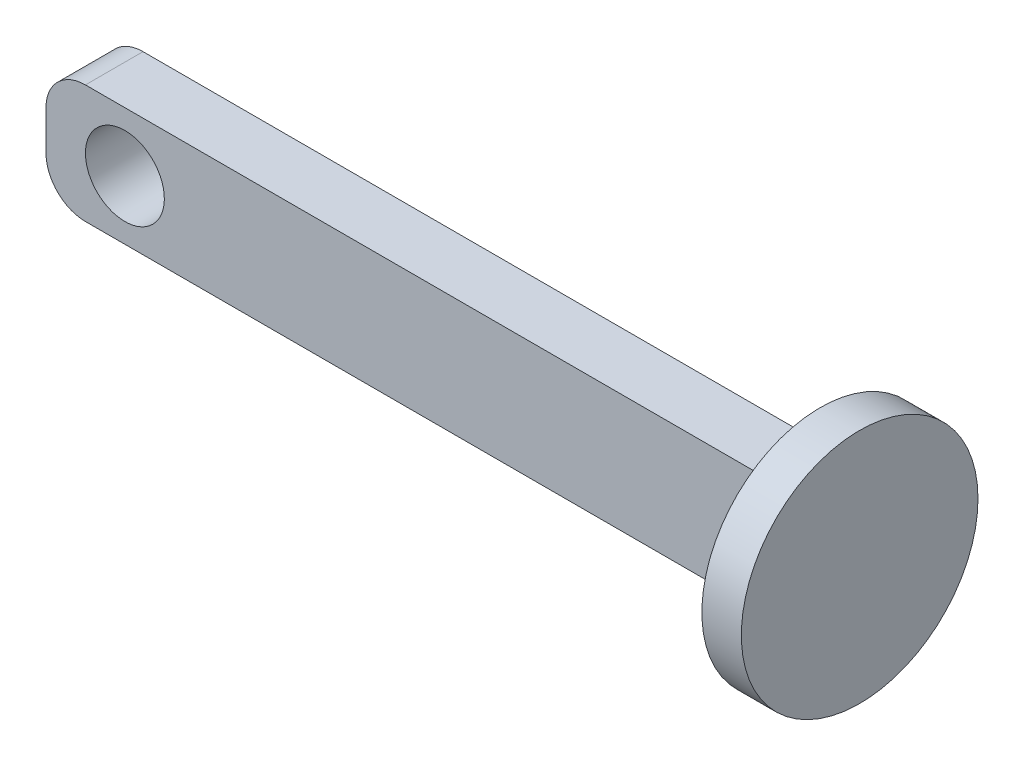
ISO-10303-21;
HEADER;
FILE_DESCRIPTION(('STEP AP214'),'2;1');
FILE_NAME('part.step','',(''),(''),'','','');
FILE_SCHEMA(('AUTOMOTIVE_DESIGN { 1 0 10303 214 1 1 1 1 }'));
ENDSEC;
DATA;
#1=APPLICATION_CONTEXT('core data for automotive mechanical design processes');
#2=APPLICATION_PROTOCOL_DEFINITION('international standard','automotive_design',2000,#1);
#3=PRODUCT_CONTEXT('',#1,'mechanical');
#4=PRODUCT('Part','Part','',(#3));
#5=PRODUCT_RELATED_PRODUCT_CATEGORY('part','',(#4));
#6=PRODUCT_DEFINITION_FORMATION('','',#4);
#7=PRODUCT_DEFINITION_CONTEXT('part definition',#1,'design');
#8=PRODUCT_DEFINITION('design','',#6,#7);
#9=PRODUCT_DEFINITION_SHAPE('','',#8);
#10=(LENGTH_UNIT() NAMED_UNIT(*) SI_UNIT(.MILLI.,.METRE.));
#11=(NAMED_UNIT(*) PLANE_ANGLE_UNIT() SI_UNIT($,.RADIAN.));
#12=(NAMED_UNIT(*) SI_UNIT($,.STERADIAN.) SOLID_ANGLE_UNIT());
#13=UNCERTAINTY_MEASURE_WITH_UNIT(LENGTH_MEASURE(1.E-05),#10,'distance_accuracy_value','');
#14=(GEOMETRIC_REPRESENTATION_CONTEXT(3) GLOBAL_UNCERTAINTY_ASSIGNED_CONTEXT((#13)) GLOBAL_UNIT_ASSIGNED_CONTEXT((#10,
#11,#12)) REPRESENTATION_CONTEXT('',''));
#15=CARTESIAN_POINT('',(0.,0.,0.));
#16=DIRECTION('',(0.,0.,1.));
#17=DIRECTION('',(1.,0.,0.));
#18=AXIS2_PLACEMENT_3D('',#15,#16,#17);
#19=CARTESIAN_POINT('',(0.,0.,0.));
#20=DIRECTION('',(1.,0.,0.));
#21=DIRECTION('',(0.,0.,-1.));
#22=AXIS2_PLACEMENT_3D('',#19,#20,#21);
#23=PLANE('',#22);
#24=CARTESIAN_POINT('',(0.,0.,0.));
#25=DIRECTION('',(1.,0.,0.));
#26=DIRECTION('',(0.,0.,-1.));
#27=AXIS2_PLACEMENT_3D('',#24,#25,#26);
#28=CIRCLE('',#27,9.525);
#29=CARTESIAN_POINT('',(0.,0.,-9.525));
#30=VERTEX_POINT('',#29);
#31=EDGE_CURVE('E120',#30,#30,#28,.T.);
#32=ORIENTED_EDGE('',*,*,#31,.F.);
#33=EDGE_LOOP('',(#32));
#34=FACE_BOUND('',#33,.T.);
#35=DIRECTION('',(0.,0.,-1.));
#36=VECTOR('',#35,1.);
#37=CARTESIAN_POINT('',(0.,4.7625,2.31775));
#38=LINE('',#37,#36);
#39=CARTESIAN_POINT('',(0.,4.7625,2.31775));
#40=VERTEX_POINT('',#39);
#41=CARTESIAN_POINT('',(0.,4.7625,-2.31775));
#42=VERTEX_POINT('',#41);
#43=EDGE_CURVE('E88',#40,#42,#38,.T.);
#44=ORIENTED_EDGE('',*,*,#43,.F.);
#45=DIRECTION('',(0.,1.,0.));
#46=VECTOR('',#45,1.);
#47=CARTESIAN_POINT('',(0.,4.7625,2.31775));
#48=LINE('',#47,#46);
#49=CARTESIAN_POINT('',(0.,-4.7625,2.31775));
#50=VERTEX_POINT('',#49);
#51=EDGE_CURVE('E100',#50,#40,#48,.T.);
#52=ORIENTED_EDGE('',*,*,#51,.F.);
#53=DIRECTION('',(0.,0.,1.));
#54=VECTOR('',#53,1.);
#55=CARTESIAN_POINT('',(0.,-4.7625,2.31775));
#56=LINE('',#55,#54);
#57=CARTESIAN_POINT('',(0.,-4.7625,-2.31775));
#58=VERTEX_POINT('',#57);
#59=EDGE_CURVE('E108',#58,#50,#56,.T.);
#60=ORIENTED_EDGE('',*,*,#59,.F.);
#61=DIRECTION('',(0.,-1.,0.));
#62=VECTOR('',#61,1.);
#63=CARTESIAN_POINT('',(0.,4.7625,-2.31775));
#64=LINE('',#63,#62);
#65=EDGE_CURVE('E103',#42,#58,#64,.T.);
#66=ORIENTED_EDGE('',*,*,#65,.F.);
#67=EDGE_LOOP('',(#44,#52,#60,#66));
#68=FACE_BOUND('',#67,.T.);
#69=ADVANCED_FACE('F31',(#34,#68),#23,.F.);
#70=CARTESIAN_POINT('',(3.175,0.,0.));
#71=DIRECTION('',(-1.,0.,0.));
#72=DIRECTION('',(0.,0.,1.));
#73=AXIS2_PLACEMENT_3D('',#70,#71,#72);
#74=CYLINDRICAL_SURFACE('',#73,9.525);
#75=CARTESIAN_POINT('',(3.175,0.,0.));
#76=DIRECTION('',(1.,0.,0.));
#77=DIRECTION('',(0.,0.,-1.));
#78=AXIS2_PLACEMENT_3D('',#75,#76,#77);
#79=CIRCLE('',#78,9.525);
#80=CARTESIAN_POINT('',(3.175,0.,-9.525));
#81=VERTEX_POINT('',#80);
#82=EDGE_CURVE('E121',#81,#81,#79,.T.);
#83=ORIENTED_EDGE('',*,*,#82,.F.);
#84=EDGE_LOOP('',(#83));
#85=FACE_BOUND('',#84,.T.);
#86=ORIENTED_EDGE('',*,*,#31,.T.);
#87=EDGE_LOOP('',(#86));
#88=FACE_BOUND('',#87,.T.);
#89=ADVANCED_FACE('F167',(#85,#88),#74,.T.);
#90=CARTESIAN_POINT('',(3.175,0.,0.));
#91=DIRECTION('',(1.,0.,0.));
#92=DIRECTION('',(0.,0.,-1.));
#93=AXIS2_PLACEMENT_3D('',#90,#91,#92);
#94=PLANE('',#93);
#95=ORIENTED_EDGE('',*,*,#82,.T.);
#96=EDGE_LOOP('',(#95));
#97=FACE_BOUND('',#96,.T.);
#98=ADVANCED_FACE('F173',(#97),#94,.T.);
#99=CARTESIAN_POINT('',(-60.,4.7625,2.31775));
#100=DIRECTION('',(0.,-1.,0.));
#101=DIRECTION('',(0.,0.,-1.));
#102=AXIS2_PLACEMENT_3D('',#99,#100,#101);
#103=PLANE('',#102);
#104=DIRECTION('',(1.,0.,0.));
#105=VECTOR('',#104,1.);
#106=CARTESIAN_POINT('',(-60.,4.7625,-2.31775));
#107=LINE('',#106,#105);
#108=CARTESIAN_POINT('',(-56.825,4.7625,-2.31775));
#109=VERTEX_POINT('',#108);
#110=EDGE_CURVE('E118',#109,#42,#107,.T.);
#111=ORIENTED_EDGE('',*,*,#110,.F.);
#112=DIRECTION('',(0.,0.,-1.));
#113=VECTOR('',#112,1.);
#114=CARTESIAN_POINT('',(-56.825,4.7625,2.31775));
#115=LINE('',#114,#113);
#116=CARTESIAN_POINT('',(-56.825,4.7625,2.31775));
#117=VERTEX_POINT('',#116);
#118=EDGE_CURVE('E11',#109,#117,#115,.F.);
#119=ORIENTED_EDGE('',*,*,#118,.T.);
#120=DIRECTION('',(1.,0.,0.));
#121=VECTOR('',#120,1.);
#122=CARTESIAN_POINT('',(-60.,4.7625,2.31775));
#123=LINE('',#122,#121);
#124=EDGE_CURVE('E85',#117,#40,#123,.T.);
#125=ORIENTED_EDGE('',*,*,#124,.T.);
#126=ORIENTED_EDGE('',*,*,#43,.T.);
#127=EDGE_LOOP('',(#111,#119,#125,#126));
#128=FACE_BOUND('',#127,.T.);
#129=ADVANCED_FACE('F87',(#128),#103,.F.);
#130=CARTESIAN_POINT('',(-60.,4.7625,-2.31775));
#131=DIRECTION('',(0.,0.,1.));
#132=DIRECTION('',(0.,-1.,0.));
#133=AXIS2_PLACEMENT_3D('',#130,#131,#132);
#134=PLANE('',#133);
#135=CARTESIAN_POINT('',(-53.65,0.,-2.31775));
#136=DIRECTION('',(0.,0.,-1.));
#137=DIRECTION('',(0.,1.,0.));
#138=AXIS2_PLACEMENT_3D('',#135,#136,#137);
#139=CIRCLE('',#138,3.175);
#140=CARTESIAN_POINT('',(-53.65,3.175,-2.31775));
#141=VERTEX_POINT('',#140);
#142=EDGE_CURVE('E150',#141,#141,#139,.T.);
#143=ORIENTED_EDGE('',*,*,#142,.F.);
#144=EDGE_LOOP('',(#143));
#145=FACE_BOUND('',#144,.T.);
#146=DIRECTION('',(1.,0.,0.));
#147=VECTOR('',#146,1.);
#148=CARTESIAN_POINT('',(-60.,-4.7625,-2.31775));
#149=LINE('',#148,#147);
#150=CARTESIAN_POINT('',(-56.825,-4.7625,-2.31775));
#151=VERTEX_POINT('',#150);
#152=EDGE_CURVE('E116',#151,#58,#149,.T.);
#153=ORIENTED_EDGE('',*,*,#152,.F.);
#154=CARTESIAN_POINT('',(-56.825,-1.5875,-2.31775));
#155=DIRECTION('',(0.,0.,1.));
#156=DIRECTION('',(0.,-1.,0.));
#157=AXIS2_PLACEMENT_3D('',#154,#155,#156);
#158=CIRCLE('',#157,3.175);
#159=CARTESIAN_POINT('',(-60.,-1.5875,-2.31775));
#160=VERTEX_POINT('',#159);
#161=EDGE_CURVE('E40',#151,#160,#158,.F.);
#162=ORIENTED_EDGE('',*,*,#161,.T.);
#163=DIRECTION('',(0.,-1.,0.));
#164=VECTOR('',#163,1.);
#165=CARTESIAN_POINT('',(-60.,4.7625,-2.31775));
#166=LINE('',#165,#164);
#167=CARTESIAN_POINT('',(-60.,1.5875,-2.31775));
#168=VERTEX_POINT('',#167);
#169=EDGE_CURVE('E107',#168,#160,#166,.T.);
#170=ORIENTED_EDGE('',*,*,#169,.F.);
#171=CARTESIAN_POINT('',(-56.825,1.5875,-2.31775));
#172=DIRECTION('',(0.,0.,1.));
#173=DIRECTION('',(0.,-1.,0.));
#174=AXIS2_PLACEMENT_3D('',#171,#172,#173);
#175=CIRCLE('',#174,3.175);
#176=EDGE_CURVE('E47',#168,#109,#175,.F.);
#177=ORIENTED_EDGE('',*,*,#176,.T.);
#178=ORIENTED_EDGE('',*,*,#110,.T.);
#179=ORIENTED_EDGE('',*,*,#65,.T.);
#180=EDGE_LOOP('',(#153,#162,#170,#177,#178,#179));
#181=FACE_BOUND('',#180,.T.);
#182=ADVANCED_FACE('F139',(#145,#181),#134,.F.);
#183=CARTESIAN_POINT('',(-60.,-4.7625,2.31775));
#184=DIRECTION('',(0.,1.,0.));
#185=DIRECTION('',(0.,0.,1.));
#186=AXIS2_PLACEMENT_3D('',#183,#184,#185);
#187=PLANE('',#186);
#188=DIRECTION('',(1.,0.,0.));
#189=VECTOR('',#188,1.);
#190=CARTESIAN_POINT('',(-60.,-4.7625,2.31775));
#191=LINE('',#190,#189);
#192=CARTESIAN_POINT('',(-56.825,-4.7625,2.31775));
#193=VERTEX_POINT('',#192);
#194=EDGE_CURVE('E93',#193,#50,#191,.T.);
#195=ORIENTED_EDGE('',*,*,#194,.F.);
#196=DIRECTION('',(0.,0.,1.));
#197=VECTOR('',#196,1.);
#198=CARTESIAN_POINT('',(-56.825,-4.7625,-2.31775));
#199=LINE('',#198,#197);
#200=EDGE_CURVE('E55',#193,#151,#199,.F.);
#201=ORIENTED_EDGE('',*,*,#200,.T.);
#202=ORIENTED_EDGE('',*,*,#152,.T.);
#203=ORIENTED_EDGE('',*,*,#59,.T.);
#204=EDGE_LOOP('',(#195,#201,#202,#203));
#205=FACE_BOUND('',#204,.T.);
#206=ADVANCED_FACE('F147',(#205),#187,.F.);
#207=CARTESIAN_POINT('',(-60.,4.7625,2.31775));
#208=DIRECTION('',(0.,0.,-1.));
#209=DIRECTION('',(0.,1.,0.));
#210=AXIS2_PLACEMENT_3D('',#207,#208,#209);
#211=PLANE('',#210);
#212=CARTESIAN_POINT('',(-53.65,0.,2.31775));
#213=DIRECTION('',(0.,0.,-1.));
#214=DIRECTION('',(0.,1.,0.));
#215=AXIS2_PLACEMENT_3D('',#212,#213,#214);
#216=CIRCLE('',#215,3.175);
#217=CARTESIAN_POINT('',(-53.65,3.175,2.31775));
#218=VERTEX_POINT('',#217);
#219=EDGE_CURVE('E35',#218,#218,#216,.T.);
#220=ORIENTED_EDGE('',*,*,#219,.T.);
#221=EDGE_LOOP('',(#220));
#222=FACE_BOUND('',#221,.T.);
#223=DIRECTION('',(0.,1.,0.));
#224=VECTOR('',#223,1.);
#225=CARTESIAN_POINT('',(-60.,4.7625,2.31775));
#226=LINE('',#225,#224);
#227=CARTESIAN_POINT('',(-60.,-1.5875,2.31775));
#228=VERTEX_POINT('',#227);
#229=CARTESIAN_POINT('',(-60.,1.5875,2.31775));
#230=VERTEX_POINT('',#229);
#231=EDGE_CURVE('E94',#228,#230,#226,.T.);
#232=ORIENTED_EDGE('',*,*,#231,.F.);
#233=CARTESIAN_POINT('',(-56.825,-1.5875,2.31775));
#234=DIRECTION('',(0.,0.,-1.));
#235=DIRECTION('',(0.,1.,0.));
#236=AXIS2_PLACEMENT_3D('',#233,#234,#235);
#237=CIRCLE('',#236,3.175);
#238=EDGE_CURVE('E134',#228,#193,#237,.F.);
#239=ORIENTED_EDGE('',*,*,#238,.T.);
#240=ORIENTED_EDGE('',*,*,#194,.T.);
#241=ORIENTED_EDGE('',*,*,#51,.T.);
#242=ORIENTED_EDGE('',*,*,#124,.F.);
#243=CARTESIAN_POINT('',(-56.825,1.5875,2.31775));
#244=DIRECTION('',(0.,0.,-1.));
#245=DIRECTION('',(0.,1.,0.));
#246=AXIS2_PLACEMENT_3D('',#243,#244,#245);
#247=CIRCLE('',#246,3.175);
#248=EDGE_CURVE('E132',#117,#230,#247,.F.);
#249=ORIENTED_EDGE('',*,*,#248,.T.);
#250=EDGE_LOOP('',(#232,#239,#240,#241,#242,#249));
#251=FACE_BOUND('',#250,.T.);
#252=ADVANCED_FACE('F106',(#222,#251),#211,.F.);
#253=CARTESIAN_POINT('',(-60.,4.7625,-2.31775));
#254=DIRECTION('',(-1.,0.,0.));
#255=DIRECTION('',(0.,0.,1.));
#256=AXIS2_PLACEMENT_3D('',#253,#254,#255);
#257=PLANE('',#256);
#258=ORIENTED_EDGE('',*,*,#169,.T.);
#259=DIRECTION('',(0.,0.,1.));
#260=VECTOR('',#259,1.);
#261=CARTESIAN_POINT('',(-60.,-1.5875,2.31775));
#262=LINE('',#261,#260);
#263=EDGE_CURVE('E129',#160,#228,#262,.T.);
#264=ORIENTED_EDGE('',*,*,#263,.T.);
#265=ORIENTED_EDGE('',*,*,#231,.T.);
#266=DIRECTION('',(0.,0.,-1.));
#267=VECTOR('',#266,1.);
#268=CARTESIAN_POINT('',(-60.,1.5875,-2.31775));
#269=LINE('',#268,#267);
#270=EDGE_CURVE('E124',#230,#168,#269,.T.);
#271=ORIENTED_EDGE('',*,*,#270,.T.);
#272=EDGE_LOOP('',(#258,#264,#265,#271));
#273=FACE_BOUND('',#272,.T.);
#274=ADVANCED_FACE('F143',(#273),#257,.T.);
#275=CARTESIAN_POINT('',(-56.825,-1.5875,-2.31775));
#276=DIRECTION('',(0.,0.,-1.));
#277=DIRECTION('',(0.,1.,0.));
#278=AXIS2_PLACEMENT_3D('',#275,#276,#277);
#279=CYLINDRICAL_SURFACE('',#278,3.175);
#280=ORIENTED_EDGE('',*,*,#161,.F.);
#281=ORIENTED_EDGE('',*,*,#200,.F.);
#282=ORIENTED_EDGE('',*,*,#238,.F.);
#283=ORIENTED_EDGE('',*,*,#263,.F.);
#284=EDGE_LOOP('',(#280,#281,#282,#283));
#285=FACE_BOUND('',#284,.T.);
#286=ADVANCED_FACE('F146',(#285),#279,.T.);
#287=CARTESIAN_POINT('',(-56.825,1.5875,-2.31775));
#288=DIRECTION('',(0.,0.,1.));
#289=DIRECTION('',(1.,0.,0.));
#290=AXIS2_PLACEMENT_3D('',#287,#288,#289);
#291=CYLINDRICAL_SURFACE('',#290,3.175);
#292=ORIENTED_EDGE('',*,*,#248,.F.);
#293=ORIENTED_EDGE('',*,*,#118,.F.);
#294=ORIENTED_EDGE('',*,*,#176,.F.);
#295=ORIENTED_EDGE('',*,*,#270,.F.);
#296=EDGE_LOOP('',(#292,#293,#294,#295));
#297=FACE_BOUND('',#296,.T.);
#298=ADVANCED_FACE('F33',(#297),#291,.T.);
#299=CARTESIAN_POINT('',(-53.65,0.,9.525));
#300=DIRECTION('',(0.,0.,-1.));
#301=DIRECTION('',(0.,1.,0.));
#302=AXIS2_PLACEMENT_3D('',#299,#300,#301);
#303=CYLINDRICAL_SURFACE('',#302,3.175);
#304=ORIENTED_EDGE('',*,*,#142,.T.);
#305=EDGE_LOOP('',(#304));
#306=FACE_BOUND('',#305,.T.);
#307=ORIENTED_EDGE('',*,*,#219,.F.);
#308=EDGE_LOOP('',(#307));
#309=FACE_BOUND('',#308,.T.);
#310=ADVANCED_FACE('F158',(#306,#309),#303,.F.);
#311=CLOSED_SHELL('',(#69,#89,#98,#129,#182,#206,#252,#274,#286,#298,#310));
#312=MANIFOLD_SOLID_BREP('B2',#311);
#313=ADVANCED_BREP_SHAPE_REPRESENTATION('',(#18,#312),#14);
#314=SHAPE_DEFINITION_REPRESENTATION(#9,#313);
ENDSEC;
END-ISO-10303-21;
